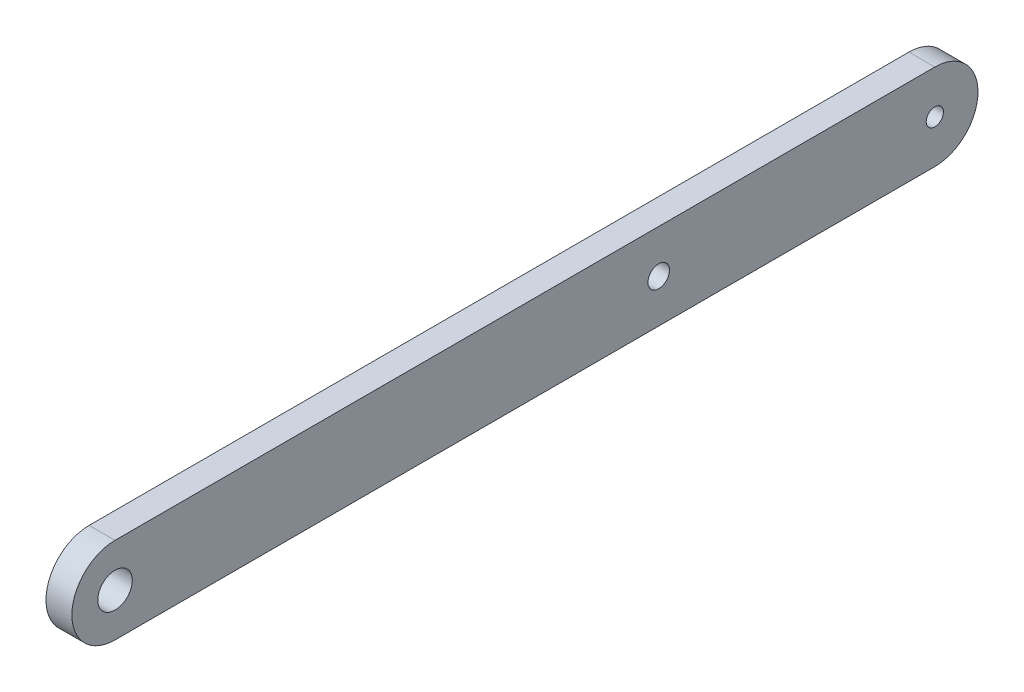
ISO-10303-21;
HEADER;
FILE_DESCRIPTION(('STEP AP214'),'2;1');
FILE_NAME('part.step','',(''),(''),'','','');
FILE_SCHEMA(('AUTOMOTIVE_DESIGN { 1 0 10303 214 1 1 1 1 }'));
ENDSEC;
DATA;
#1=APPLICATION_CONTEXT('core data for automotive mechanical design processes');
#2=APPLICATION_PROTOCOL_DEFINITION('international standard','automotive_design',2000,#1);
#3=PRODUCT_CONTEXT('',#1,'mechanical');
#4=PRODUCT('Part','Part','',(#3));
#5=PRODUCT_RELATED_PRODUCT_CATEGORY('part','',(#4));
#6=PRODUCT_DEFINITION_FORMATION('','',#4);
#7=PRODUCT_DEFINITION_CONTEXT('part definition',#1,'design');
#8=PRODUCT_DEFINITION('design','',#6,#7);
#9=PRODUCT_DEFINITION_SHAPE('','',#8);
#10=(LENGTH_UNIT() NAMED_UNIT(*) SI_UNIT(.MILLI.,.METRE.));
#11=(NAMED_UNIT(*) PLANE_ANGLE_UNIT() SI_UNIT($,.RADIAN.));
#12=(NAMED_UNIT(*) SI_UNIT($,.STERADIAN.) SOLID_ANGLE_UNIT());
#13=UNCERTAINTY_MEASURE_WITH_UNIT(LENGTH_MEASURE(1.E-05),#10,'distance_accuracy_value','');
#14=(GEOMETRIC_REPRESENTATION_CONTEXT(3) GLOBAL_UNCERTAINTY_ASSIGNED_CONTEXT((#13)) GLOBAL_UNIT_ASSIGNED_CONTEXT((#10,
#11,#12)) REPRESENTATION_CONTEXT('',''));
#15=CARTESIAN_POINT('',(0.,0.,0.));
#16=DIRECTION('',(0.,0.,1.));
#17=DIRECTION('',(1.,0.,0.));
#18=AXIS2_PLACEMENT_3D('',#15,#16,#17);
#19=CARTESIAN_POINT('',(3.,4.99999999999999,0.));
#20=DIRECTION('',(1.,0.,0.));
#21=DIRECTION('',(0.,0.,-1.));
#22=AXIS2_PLACEMENT_3D('',#19,#20,#21);
#23=PLANE('',#22);
#24=CARTESIAN_POINT('',(3.,4.99999999999999,0.));
#25=DIRECTION('',(1.,0.,0.));
#26=DIRECTION('',(0.,0.,-1.));
#27=AXIS2_PLACEMENT_3D('',#24,#25,#26);
#28=CIRCLE('',#27,2.);
#29=CARTESIAN_POINT('',(3.,4.99999999999999,-2.));
#30=VERTEX_POINT('',#29);
#31=EDGE_CURVE('E116',#30,#30,#28,.T.);
#32=ORIENTED_EDGE('',*,*,#31,.F.);
#33=EDGE_LOOP('',(#32));
#34=FACE_BOUND('',#33,.T.);
#35=CARTESIAN_POINT('',(3.,4.99999999999999,0.));
#36=DIRECTION('',(1.,0.,0.));
#37=DIRECTION('',(0.,0.,-1.));
#38=AXIS2_PLACEMENT_3D('',#35,#36,#37);
#39=CIRCLE('',#38,5.);
#40=CARTESIAN_POINT('',(3.,10.,0.));
#41=VERTEX_POINT('',#40);
#42=CARTESIAN_POINT('',(3.,0.,0.));
#43=VERTEX_POINT('',#42);
#44=EDGE_CURVE('E86',#41,#43,#39,.T.);
#45=ORIENTED_EDGE('',*,*,#44,.T.);
#46=DIRECTION('',(0.,0.,-1.));
#47=VECTOR('',#46,1.);
#48=CARTESIAN_POINT('',(3.,0.,0.));
#49=LINE('',#48,#47);
#50=CARTESIAN_POINT('',(3.,0.,-95.));
#51=VERTEX_POINT('',#50);
#52=EDGE_CURVE('E81',#43,#51,#49,.T.);
#53=ORIENTED_EDGE('',*,*,#52,.T.);
#54=CARTESIAN_POINT('',(3.,5.,-95.));
#55=DIRECTION('',(1.,0.,0.));
#56=DIRECTION('',(0.,0.,1.));
#57=AXIS2_PLACEMENT_3D('',#54,#55,#56);
#58=CIRCLE('',#57,5.);
#59=CARTESIAN_POINT('',(3.,10.,-95.));
#60=VERTEX_POINT('',#59);
#61=EDGE_CURVE('E84',#51,#60,#58,.T.);
#62=ORIENTED_EDGE('',*,*,#61,.T.);
#63=DIRECTION('',(0.,0.,1.));
#64=VECTOR('',#63,1.);
#65=CARTESIAN_POINT('',(3.,10.,0.));
#66=LINE('',#65,#64);
#67=EDGE_CURVE('E51',#60,#41,#66,.T.);
#68=ORIENTED_EDGE('',*,*,#67,.T.);
#69=EDGE_LOOP('',(#45,#53,#62,#68));
#70=FACE_BOUND('',#69,.T.);
#71=CARTESIAN_POINT('',(3.,5.,-95.));
#72=DIRECTION('',(1.,0.,0.));
#73=DIRECTION('',(0.,0.,-1.));
#74=AXIS2_PLACEMENT_3D('',#71,#72,#73);
#75=CIRCLE('',#74,0.999999999999998);
#76=CARTESIAN_POINT('',(3.,5.,-96.));
#77=VERTEX_POINT('',#76);
#78=EDGE_CURVE('E101',#77,#77,#75,.T.);
#79=ORIENTED_EDGE('',*,*,#78,.F.);
#80=EDGE_LOOP('',(#79));
#81=FACE_BOUND('',#80,.T.);
#82=CARTESIAN_POINT('',(3.,4.99999999999999,-63.));
#83=DIRECTION('',(1.,0.,0.));
#84=DIRECTION('',(0.,0.,-1.));
#85=AXIS2_PLACEMENT_3D('',#82,#83,#84);
#86=CIRCLE('',#85,1.25);
#87=CARTESIAN_POINT('',(3.,4.99999999999999,-64.25));
#88=VERTEX_POINT('',#87);
#89=EDGE_CURVE('E122',#88,#88,#86,.T.);
#90=ORIENTED_EDGE('',*,*,#89,.F.);
#91=EDGE_LOOP('',(#90));
#92=FACE_BOUND('',#91,.T.);
#93=ADVANCED_FACE('F34',(#34,#70,#81,#92),#23,.T.);
#94=CARTESIAN_POINT('',(0.,4.99999999999999,0.));
#95=DIRECTION('',(1.,0.,0.));
#96=DIRECTION('',(0.,0.,-1.));
#97=AXIS2_PLACEMENT_3D('',#94,#95,#96);
#98=PLANE('',#97);
#99=CARTESIAN_POINT('',(0.,4.99999999999999,0.));
#100=DIRECTION('',(1.,0.,0.));
#101=DIRECTION('',(0.,0.,-1.));
#102=AXIS2_PLACEMENT_3D('',#99,#100,#101);
#103=CIRCLE('',#102,5.);
#104=CARTESIAN_POINT('',(0.,10.,0.));
#105=VERTEX_POINT('',#104);
#106=CARTESIAN_POINT('',(0.,0.,0.));
#107=VERTEX_POINT('',#106);
#108=EDGE_CURVE('E98',#105,#107,#103,.T.);
#109=ORIENTED_EDGE('',*,*,#108,.F.);
#110=DIRECTION('',(0.,0.,1.));
#111=VECTOR('',#110,1.);
#112=CARTESIAN_POINT('',(0.,10.,0.));
#113=LINE('',#112,#111);
#114=CARTESIAN_POINT('',(0.,10.,-95.));
#115=VERTEX_POINT('',#114);
#116=EDGE_CURVE('E74',#115,#105,#113,.T.);
#117=ORIENTED_EDGE('',*,*,#116,.F.);
#118=CARTESIAN_POINT('',(0.,5.,-95.));
#119=DIRECTION('',(1.,0.,0.));
#120=DIRECTION('',(0.,0.,1.));
#121=AXIS2_PLACEMENT_3D('',#118,#119,#120);
#122=CIRCLE('',#121,5.);
#123=CARTESIAN_POINT('',(0.,0.,-95.));
#124=VERTEX_POINT('',#123);
#125=EDGE_CURVE('E68',#124,#115,#122,.T.);
#126=ORIENTED_EDGE('',*,*,#125,.F.);
#127=DIRECTION('',(0.,0.,-1.));
#128=VECTOR('',#127,1.);
#129=CARTESIAN_POINT('',(0.,0.,0.));
#130=LINE('',#129,#128);
#131=EDGE_CURVE('E90',#107,#124,#130,.T.);
#132=ORIENTED_EDGE('',*,*,#131,.F.);
#133=EDGE_LOOP('',(#109,#117,#126,#132));
#134=FACE_BOUND('',#133,.T.);
#135=CARTESIAN_POINT('',(0.,5.,-95.));
#136=DIRECTION('',(1.,0.,0.));
#137=DIRECTION('',(0.,0.,-1.));
#138=AXIS2_PLACEMENT_3D('',#135,#136,#137);
#139=CIRCLE('',#138,0.999999999999998);
#140=CARTESIAN_POINT('',(0.,5.,-96.));
#141=VERTEX_POINT('',#140);
#142=EDGE_CURVE('E113',#141,#141,#139,.T.);
#143=ORIENTED_EDGE('',*,*,#142,.T.);
#144=EDGE_LOOP('',(#143));
#145=FACE_BOUND('',#144,.T.);
#146=CARTESIAN_POINT('',(0.,4.99999999999999,0.));
#147=DIRECTION('',(1.,0.,0.));
#148=DIRECTION('',(0.,0.,-1.));
#149=AXIS2_PLACEMENT_3D('',#146,#147,#148);
#150=CIRCLE('',#149,2.);
#151=CARTESIAN_POINT('',(0.,4.99999999999999,-2.));
#152=VERTEX_POINT('',#151);
#153=EDGE_CURVE('E119',#152,#152,#150,.T.);
#154=ORIENTED_EDGE('',*,*,#153,.T.);
#155=EDGE_LOOP('',(#154));
#156=FACE_BOUND('',#155,.T.);
#157=CARTESIAN_POINT('',(0.,4.99999999999999,-63.));
#158=DIRECTION('',(1.,0.,0.));
#159=DIRECTION('',(0.,0.,-1.));
#160=AXIS2_PLACEMENT_3D('',#157,#158,#159);
#161=CIRCLE('',#160,1.25);
#162=CARTESIAN_POINT('',(0.,4.99999999999999,-64.25));
#163=VERTEX_POINT('',#162);
#164=EDGE_CURVE('E125',#163,#163,#161,.T.);
#165=ORIENTED_EDGE('',*,*,#164,.T.);
#166=EDGE_LOOP('',(#165));
#167=FACE_BOUND('',#166,.T.);
#168=ADVANCED_FACE('F109',(#134,#145,#156,#167),#98,.F.);
#169=CARTESIAN_POINT('',(3.,4.99999999999999,0.));
#170=DIRECTION('',(-1.,0.,0.));
#171=DIRECTION('',(0.,0.,1.));
#172=AXIS2_PLACEMENT_3D('',#169,#170,#171);
#173=CYLINDRICAL_SURFACE('',#172,5.);
#174=ORIENTED_EDGE('',*,*,#108,.T.);
#175=DIRECTION('',(-1.,0.,0.));
#176=VECTOR('',#175,1.);
#177=CARTESIAN_POINT('',(3.,0.,0.));
#178=LINE('',#177,#176);
#179=EDGE_CURVE('E11',#43,#107,#178,.T.);
#180=ORIENTED_EDGE('',*,*,#179,.F.);
#181=ORIENTED_EDGE('',*,*,#44,.F.);
#182=DIRECTION('',(-1.,0.,0.));
#183=VECTOR('',#182,1.);
#184=CARTESIAN_POINT('',(3.,10.,0.));
#185=LINE('',#184,#183);
#186=EDGE_CURVE('E94',#41,#105,#185,.T.);
#187=ORIENTED_EDGE('',*,*,#186,.T.);
#188=EDGE_LOOP('',(#174,#180,#181,#187));
#189=FACE_BOUND('',#188,.T.);
#190=ADVANCED_FACE('F36',(#189),#173,.T.);
#191=CARTESIAN_POINT('',(3.,0.,0.));
#192=DIRECTION('',(0.,1.,0.));
#193=DIRECTION('',(0.,0.,1.));
#194=AXIS2_PLACEMENT_3D('',#191,#192,#193);
#195=PLANE('',#194);
#196=ORIENTED_EDGE('',*,*,#131,.T.);
#197=DIRECTION('',(-1.,0.,0.));
#198=VECTOR('',#197,1.);
#199=CARTESIAN_POINT('',(3.,0.,-95.));
#200=LINE('',#199,#198);
#201=EDGE_CURVE('E43',#51,#124,#200,.T.);
#202=ORIENTED_EDGE('',*,*,#201,.F.);
#203=ORIENTED_EDGE('',*,*,#52,.F.);
#204=ORIENTED_EDGE('',*,*,#179,.T.);
#205=EDGE_LOOP('',(#196,#202,#203,#204));
#206=FACE_BOUND('',#205,.T.);
#207=ADVANCED_FACE('F89',(#206),#195,.F.);
#208=CARTESIAN_POINT('',(3.,5.,-95.));
#209=DIRECTION('',(-1.,0.,0.));
#210=DIRECTION('',(0.,0.,1.));
#211=AXIS2_PLACEMENT_3D('',#208,#209,#210);
#212=CYLINDRICAL_SURFACE('',#211,5.);
#213=ORIENTED_EDGE('',*,*,#125,.T.);
#214=DIRECTION('',(-1.,0.,0.));
#215=VECTOR('',#214,1.);
#216=CARTESIAN_POINT('',(3.,10.,-95.));
#217=LINE('',#216,#215);
#218=EDGE_CURVE('E91',#60,#115,#217,.T.);
#219=ORIENTED_EDGE('',*,*,#218,.F.);
#220=ORIENTED_EDGE('',*,*,#61,.F.);
#221=ORIENTED_EDGE('',*,*,#201,.T.);
#222=EDGE_LOOP('',(#213,#219,#220,#221));
#223=FACE_BOUND('',#222,.T.);
#224=ADVANCED_FACE('F92',(#223),#212,.T.);
#225=CARTESIAN_POINT('',(3.,10.,0.));
#226=DIRECTION('',(0.,-1.,0.));
#227=DIRECTION('',(0.,0.,-1.));
#228=AXIS2_PLACEMENT_3D('',#225,#226,#227);
#229=PLANE('',#228);
#230=ORIENTED_EDGE('',*,*,#116,.T.);
#231=ORIENTED_EDGE('',*,*,#186,.F.);
#232=ORIENTED_EDGE('',*,*,#67,.F.);
#233=ORIENTED_EDGE('',*,*,#218,.T.);
#234=EDGE_LOOP('',(#230,#231,#232,#233));
#235=FACE_BOUND('',#234,.T.);
#236=ADVANCED_FACE('F106',(#235),#229,.F.);
#237=CARTESIAN_POINT('',(3.,5.,-95.));
#238=DIRECTION('',(-1.,0.,0.));
#239=DIRECTION('',(0.,0.,1.));
#240=AXIS2_PLACEMENT_3D('',#237,#238,#239);
#241=CYLINDRICAL_SURFACE('',#240,0.999999999999998);
#242=ORIENTED_EDGE('',*,*,#78,.T.);
#243=EDGE_LOOP('',(#242));
#244=FACE_BOUND('',#243,.T.);
#245=ORIENTED_EDGE('',*,*,#142,.F.);
#246=EDGE_LOOP('',(#245));
#247=FACE_BOUND('',#246,.T.);
#248=ADVANCED_FACE('F143',(#244,#247),#241,.F.);
#249=CARTESIAN_POINT('',(3.,4.99999999999999,0.));
#250=DIRECTION('',(-1.,0.,0.));
#251=DIRECTION('',(0.,0.,1.));
#252=AXIS2_PLACEMENT_3D('',#249,#250,#251);
#253=CYLINDRICAL_SURFACE('',#252,2.);
#254=ORIENTED_EDGE('',*,*,#31,.T.);
#255=EDGE_LOOP('',(#254));
#256=FACE_BOUND('',#255,.T.);
#257=ORIENTED_EDGE('',*,*,#153,.F.);
#258=EDGE_LOOP('',(#257));
#259=FACE_BOUND('',#258,.T.);
#260=ADVANCED_FACE('F189',(#256,#259),#253,.F.);
#261=CARTESIAN_POINT('',(3.,4.99999999999999,-63.));
#262=DIRECTION('',(-1.,0.,0.));
#263=DIRECTION('',(0.,0.,1.));
#264=AXIS2_PLACEMENT_3D('',#261,#262,#263);
#265=CYLINDRICAL_SURFACE('',#264,1.25);
#266=ORIENTED_EDGE('',*,*,#89,.T.);
#267=EDGE_LOOP('',(#266));
#268=FACE_BOUND('',#267,.T.);
#269=ORIENTED_EDGE('',*,*,#164,.F.);
#270=EDGE_LOOP('',(#269));
#271=FACE_BOUND('',#270,.T.);
#272=ADVANCED_FACE('F131',(#268,#271),#265,.F.);
#273=CLOSED_SHELL('',(#93,#168,#190,#207,#224,#236,#248,#260,#272));
#274=MANIFOLD_SOLID_BREP('B2',#273);
#275=ADVANCED_BREP_SHAPE_REPRESENTATION('',(#18,#274),#14);
#276=SHAPE_DEFINITION_REPRESENTATION(#9,#275);
ENDSEC;
END-ISO-10303-21;
